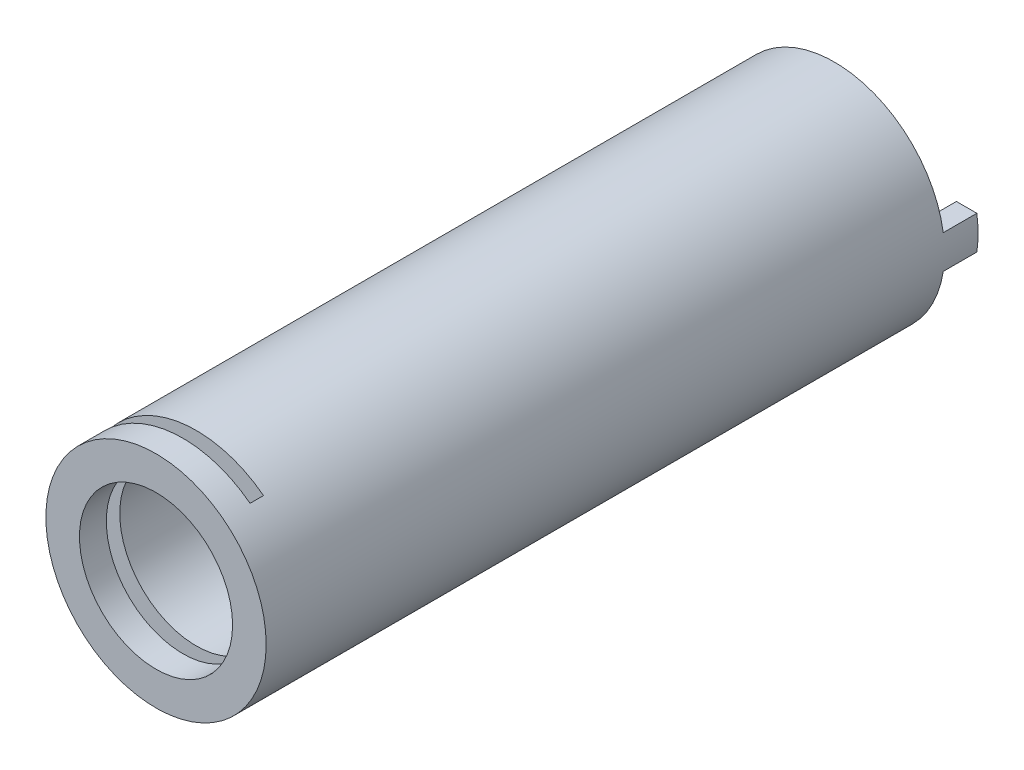
ISO-10303-21;
HEADER;
FILE_DESCRIPTION(('STEP AP214'),'2;1');
FILE_NAME('part.step','',(''),(''),'','','');
FILE_SCHEMA(('AUTOMOTIVE_DESIGN { 1 0 10303 214 1 1 1 1 }'));
ENDSEC;
DATA;
#1=APPLICATION_CONTEXT('core data for automotive mechanical design processes');
#2=APPLICATION_PROTOCOL_DEFINITION('international standard','automotive_design',2000,#1);
#3=PRODUCT_CONTEXT('',#1,'mechanical');
#4=PRODUCT('Part','Part','',(#3));
#5=PRODUCT_RELATED_PRODUCT_CATEGORY('part','',(#4));
#6=PRODUCT_DEFINITION_FORMATION('','',#4);
#7=PRODUCT_DEFINITION_CONTEXT('part definition',#1,'design');
#8=PRODUCT_DEFINITION('design','',#6,#7);
#9=PRODUCT_DEFINITION_SHAPE('','',#8);
#10=(LENGTH_UNIT() NAMED_UNIT(*) SI_UNIT(.MILLI.,.METRE.));
#11=(NAMED_UNIT(*) PLANE_ANGLE_UNIT() SI_UNIT($,.RADIAN.));
#12=(NAMED_UNIT(*) SI_UNIT($,.STERADIAN.) SOLID_ANGLE_UNIT());
#13=UNCERTAINTY_MEASURE_WITH_UNIT(LENGTH_MEASURE(1.E-05),#10,'distance_accuracy_value','');
#14=(GEOMETRIC_REPRESENTATION_CONTEXT(3) GLOBAL_UNCERTAINTY_ASSIGNED_CONTEXT((#13)) GLOBAL_UNIT_ASSIGNED_CONTEXT((#10,
#11,#12)) REPRESENTATION_CONTEXT('',''));
#15=CARTESIAN_POINT('',(0.,0.,0.));
#16=DIRECTION('',(0.,0.,1.));
#17=DIRECTION('',(1.,0.,0.));
#18=AXIS2_PLACEMENT_3D('',#15,#16,#17);
#19=CARTESIAN_POINT('',(0.,0.,0.));
#20=DIRECTION('',(0.,0.,1.));
#21=DIRECTION('',(1.,0.,0.));
#22=AXIS2_PLACEMENT_3D('',#19,#20,#21);
#23=PLANE('',#22);
#24=CARTESIAN_POINT('',(0.,0.,0.));
#25=DIRECTION('',(0.,0.,1.));
#26=DIRECTION('',(1.,0.,0.));
#27=AXIS2_PLACEMENT_3D('',#24,#25,#26);
#28=CIRCLE('',#27,11.4);
#29=CARTESIAN_POINT('',(11.4,0.,0.));
#30=VERTEX_POINT('',#29);
#31=EDGE_CURVE('E210',#30,#30,#28,.T.);
#32=ORIENTED_EDGE('',*,*,#31,.T.);
#33=EDGE_LOOP('',(#32));
#34=FACE_BOUND('',#33,.T.);
#35=DIRECTION('',(1.,0.,0.));
#36=VECTOR('',#35,1.);
#37=CARTESIAN_POINT('',(-13.1647255953172,2.5,0.));
#38=LINE('',#37,#36);
#39=CARTESIAN_POINT('',(-16.2083311910881,2.5,0.));
#40=VERTEX_POINT('',#39);
#41=CARTESIAN_POINT('',(-13.1647255953172,2.49999999999999,0.));
#42=VERTEX_POINT('',#41);
#43=EDGE_CURVE('E142',#40,#42,#38,.T.);
#44=ORIENTED_EDGE('',*,*,#43,.F.);
#45=CARTESIAN_POINT('',(0.,0.,0.));
#46=DIRECTION('',(0.,0.,1.));
#47=DIRECTION('',(1.,0.,0.));
#48=AXIS2_PLACEMENT_3D('',#45,#46,#47);
#49=CIRCLE('',#48,16.4);
#50=CARTESIAN_POINT('',(16.2083311910881,2.5,0.));
#51=VERTEX_POINT('',#50);
#52=EDGE_CURVE('E220',#51,#40,#49,.T.);
#53=ORIENTED_EDGE('',*,*,#52,.F.);
#54=DIRECTION('',(1.,0.,0.));
#55=VECTOR('',#54,1.);
#56=CARTESIAN_POINT('',(16.2083311910881,2.5,0.));
#57=LINE('',#56,#55);
#58=CARTESIAN_POINT('',(13.1647255953172,2.5,0.));
#59=VERTEX_POINT('',#58);
#60=EDGE_CURVE('E65',#59,#51,#57,.T.);
#61=ORIENTED_EDGE('',*,*,#60,.F.);
#62=CARTESIAN_POINT('',(0.,0.,0.));
#63=DIRECTION('',(0.,0.,1.));
#64=DIRECTION('',(-1.,0.,0.));
#65=AXIS2_PLACEMENT_3D('',#62,#63,#64);
#66=CIRCLE('',#65,13.4);
#67=CARTESIAN_POINT('',(13.1647255953172,-2.5,0.));
#68=VERTEX_POINT('',#67);
#69=EDGE_CURVE('E177',#68,#59,#66,.T.);
#70=ORIENTED_EDGE('',*,*,#69,.F.);
#71=DIRECTION('',(-1.,0.,0.));
#72=VECTOR('',#71,1.);
#73=CARTESIAN_POINT('',(16.2083311910881,-2.5,0.));
#74=LINE('',#73,#72);
#75=CARTESIAN_POINT('',(16.2083311910881,-2.5,0.));
#76=VERTEX_POINT('',#75);
#77=EDGE_CURVE('E160',#76,#68,#74,.T.);
#78=ORIENTED_EDGE('',*,*,#77,.F.);
#79=CARTESIAN_POINT('',(-16.2083311910881,-2.5,0.));
#80=VERTEX_POINT('',#79);
#81=EDGE_CURVE('E151',#80,#76,#49,.T.);
#82=ORIENTED_EDGE('',*,*,#81,.F.);
#83=DIRECTION('',(-1.,0.,0.));
#84=VECTOR('',#83,1.);
#85=CARTESIAN_POINT('',(-13.1647255953172,-2.5,0.));
#86=LINE('',#85,#84);
#87=CARTESIAN_POINT('',(-13.1647255953172,-2.5,0.));
#88=VERTEX_POINT('',#87);
#89=EDGE_CURVE('E143',#88,#80,#86,.T.);
#90=ORIENTED_EDGE('',*,*,#89,.F.);
#91=CARTESIAN_POINT('',(0.,0.,0.));
#92=DIRECTION('',(0.,0.,1.));
#93=DIRECTION('',(-1.,0.,0.));
#94=AXIS2_PLACEMENT_3D('',#91,#92,#93);
#95=CIRCLE('',#94,13.4);
#96=EDGE_CURVE('E132',#42,#88,#95,.T.);
#97=ORIENTED_EDGE('',*,*,#96,.F.);
#98=EDGE_LOOP('',(#44,#53,#61,#70,#78,#82,#90,#97));
#99=FACE_BOUND('',#98,.T.);
#100=ADVANCED_FACE('F42',(#34,#99),#23,.F.);
#101=CARTESIAN_POINT('',(0.,0.,101.));
#102=DIRECTION('',(0.,0.,1.));
#103=DIRECTION('',(1.,0.,0.));
#104=AXIS2_PLACEMENT_3D('',#101,#102,#103);
#105=PLANE('',#104);
#106=CARTESIAN_POINT('',(0.,0.,101.));
#107=DIRECTION('',(0.,0.,1.));
#108=DIRECTION('',(1.,0.,0.));
#109=AXIS2_PLACEMENT_3D('',#106,#107,#108);
#110=CIRCLE('',#109,16.4);
#111=CARTESIAN_POINT('',(16.4,0.,101.));
#112=VERTEX_POINT('',#111);
#113=EDGE_CURVE('E216',#112,#112,#110,.T.);
#114=ORIENTED_EDGE('',*,*,#113,.T.);
#115=EDGE_LOOP('',(#114));
#116=FACE_BOUND('',#115,.T.);
#117=CARTESIAN_POINT('',(0.,0.,101.));
#118=DIRECTION('',(0.,0.,1.));
#119=DIRECTION('',(1.,0.,0.));
#120=AXIS2_PLACEMENT_3D('',#117,#118,#119);
#121=CIRCLE('',#120,11.4);
#122=CARTESIAN_POINT('',(11.4,0.,101.));
#123=VERTEX_POINT('',#122);
#124=EDGE_CURVE('E211',#123,#123,#121,.T.);
#125=ORIENTED_EDGE('',*,*,#124,.F.);
#126=EDGE_LOOP('',(#125));
#127=FACE_BOUND('',#126,.T.);
#128=ADVANCED_FACE('F258',(#116,#127),#105,.T.);
#129=CARTESIAN_POINT('',(0.,0.,101.));
#130=DIRECTION('',(0.,0.,-1.));
#131=DIRECTION('',(-1.,0.,0.));
#132=AXIS2_PLACEMENT_3D('',#129,#130,#131);
#133=CYLINDRICAL_SURFACE('',#132,16.4);
#134=CARTESIAN_POINT('',(0.,0.,97.));
#135=DIRECTION('',(0.,0.,-1.));
#136=DIRECTION('',(-1.,0.,0.));
#137=AXIS2_PLACEMENT_3D('',#134,#135,#136);
#138=CIRCLE('',#137,16.4);
#139=CARTESIAN_POINT('',(10.0001,-12.9983845146233,97.));
#140=VERTEX_POINT('',#139);
#141=CARTESIAN_POINT('',(10.0001,12.9983845146233,97.));
#142=VERTEX_POINT('',#141);
#143=EDGE_CURVE('E207',#140,#142,#138,.T.);
#144=ORIENTED_EDGE('',*,*,#143,.F.);
#145=DIRECTION('',(0.,0.,-1.));
#146=VECTOR('',#145,1.);
#147=CARTESIAN_POINT('',(10.0001,-12.9983845146233,101.));
#148=LINE('',#147,#146);
#149=CARTESIAN_POINT('',(10.0001,-12.9983845146233,95.));
#150=VERTEX_POINT('',#149);
#151=EDGE_CURVE('E202',#140,#150,#148,.T.);
#152=ORIENTED_EDGE('',*,*,#151,.T.);
#153=CARTESIAN_POINT('',(0.,0.,95.));
#154=DIRECTION('',(0.,0.,1.));
#155=DIRECTION('',(1.,0.,0.));
#156=AXIS2_PLACEMENT_3D('',#153,#154,#155);
#157=CIRCLE('',#156,16.4);
#158=CARTESIAN_POINT('',(10.0001,12.9983845146233,95.));
#159=VERTEX_POINT('',#158);
#160=EDGE_CURVE('E205',#159,#150,#157,.T.);
#161=ORIENTED_EDGE('',*,*,#160,.F.);
#162=DIRECTION('',(0.,0.,-1.));
#163=VECTOR('',#162,1.);
#164=CARTESIAN_POINT('',(10.0001,12.9983845146233,101.));
#165=LINE('',#164,#163);
#166=EDGE_CURVE('E199',#159,#142,#165,.F.);
#167=ORIENTED_EDGE('',*,*,#166,.T.);
#168=EDGE_LOOP('',(#144,#152,#161,#167));
#169=FACE_BOUND('',#168,.T.);
#170=ORIENTED_EDGE('',*,*,#113,.F.);
#171=EDGE_LOOP('',(#170));
#172=FACE_BOUND('',#171,.T.);
#173=ORIENTED_EDGE('',*,*,#52,.T.);
#174=DIRECTION('',(0.,0.,1.));
#175=VECTOR('',#174,1.);
#176=CARTESIAN_POINT('',(-16.2083311910881,2.5,-5.));
#177=LINE('',#176,#175);
#178=CARTESIAN_POINT('',(-16.2083311910881,2.5,-5.));
#179=VERTEX_POINT('',#178);
#180=EDGE_CURVE('E396',#179,#40,#177,.T.);
#181=ORIENTED_EDGE('',*,*,#180,.F.);
#182=CARTESIAN_POINT('',(0.,0.,-5.));
#183=DIRECTION('',(0.,0.,-1.));
#184=DIRECTION('',(-1.,0.,0.));
#185=AXIS2_PLACEMENT_3D('',#182,#183,#184);
#186=CIRCLE('',#185,16.4);
#187=CARTESIAN_POINT('',(-16.2083311910881,-2.5,-5.));
#188=VERTEX_POINT('',#187);
#189=EDGE_CURVE('E152',#188,#179,#186,.T.);
#190=ORIENTED_EDGE('',*,*,#189,.F.);
#191=DIRECTION('',(0.,0.,1.));
#192=VECTOR('',#191,1.);
#193=CARTESIAN_POINT('',(-16.2083311910881,-2.5,-5.));
#194=LINE('',#193,#192);
#195=EDGE_CURVE('E57',#188,#80,#194,.T.);
#196=ORIENTED_EDGE('',*,*,#195,.T.);
#197=ORIENTED_EDGE('',*,*,#81,.T.);
#198=DIRECTION('',(0.,0.,1.));
#199=VECTOR('',#198,1.);
#200=CARTESIAN_POINT('',(16.2083311910881,-2.5,-5.));
#201=LINE('',#200,#199);
#202=CARTESIAN_POINT('',(16.2083311910881,-2.5,-5.));
#203=VERTEX_POINT('',#202);
#204=EDGE_CURVE('E188',#203,#76,#201,.T.);
#205=ORIENTED_EDGE('',*,*,#204,.F.);
#206=CARTESIAN_POINT('',(0.,0.,-5.));
#207=DIRECTION('',(0.,0.,-1.));
#208=DIRECTION('',(-1.,0.,0.));
#209=AXIS2_PLACEMENT_3D('',#206,#207,#208);
#210=CIRCLE('',#209,16.4);
#211=CARTESIAN_POINT('',(16.2083311910881,2.5,-5.));
#212=VERTEX_POINT('',#211);
#213=EDGE_CURVE('E165',#212,#203,#210,.T.);
#214=ORIENTED_EDGE('',*,*,#213,.F.);
#215=DIRECTION('',(0.,0.,1.));
#216=VECTOR('',#215,1.);
#217=CARTESIAN_POINT('',(16.2083311910881,2.5,-5.));
#218=LINE('',#217,#216);
#219=EDGE_CURVE('E174',#212,#51,#218,.T.);
#220=ORIENTED_EDGE('',*,*,#219,.T.);
#221=EDGE_LOOP('',(#173,#181,#190,#196,#197,#205,#214,#220));
#222=FACE_BOUND('',#221,.T.);
#223=ADVANCED_FACE('F44',(#169,#172,#222),#133,.T.);
#224=CARTESIAN_POINT('',(0.,0.,101.));
#225=DIRECTION('',(0.,0.,-1.));
#226=DIRECTION('',(-1.,0.,0.));
#227=AXIS2_PLACEMENT_3D('',#224,#225,#226);
#228=CYLINDRICAL_SURFACE('',#227,11.4);
#229=DIRECTION('',(0.,0.,-1.));
#230=VECTOR('',#229,1.);
#231=CARTESIAN_POINT('',(10.0001,-5.47339017337518,101.));
#232=LINE('',#231,#230);
#233=CARTESIAN_POINT('',(10.0001,-5.47339017337518,97.));
#234=VERTEX_POINT('',#233);
#235=CARTESIAN_POINT('',(10.0001,-5.47339017337518,95.));
#236=VERTEX_POINT('',#235);
#237=EDGE_CURVE('E11',#234,#236,#232,.T.);
#238=ORIENTED_EDGE('',*,*,#237,.F.);
#239=CARTESIAN_POINT('',(0.,0.,97.));
#240=DIRECTION('',(0.,0.,-1.));
#241=DIRECTION('',(-1.,0.,0.));
#242=AXIS2_PLACEMENT_3D('',#239,#240,#241);
#243=CIRCLE('',#242,11.4);
#244=CARTESIAN_POINT('',(10.0001,5.47339017337518,97.));
#245=VERTEX_POINT('',#244);
#246=EDGE_CURVE('E50',#234,#245,#243,.T.);
#247=ORIENTED_EDGE('',*,*,#246,.T.);
#248=DIRECTION('',(0.,0.,-1.));
#249=VECTOR('',#248,1.);
#250=CARTESIAN_POINT('',(10.0001,5.47339017337518,101.));
#251=LINE('',#250,#249);
#252=CARTESIAN_POINT('',(10.0001,5.47339017337518,95.));
#253=VERTEX_POINT('',#252);
#254=EDGE_CURVE('E219',#253,#245,#251,.F.);
#255=ORIENTED_EDGE('',*,*,#254,.F.);
#256=CARTESIAN_POINT('',(0.,0.,95.));
#257=DIRECTION('',(0.,0.,1.));
#258=DIRECTION('',(1.,0.,0.));
#259=AXIS2_PLACEMENT_3D('',#256,#257,#258);
#260=CIRCLE('',#259,11.4);
#261=EDGE_CURVE('E224',#253,#236,#260,.T.);
#262=ORIENTED_EDGE('',*,*,#261,.T.);
#263=EDGE_LOOP('',(#238,#247,#255,#262));
#264=FACE_BOUND('',#263,.T.);
#265=ORIENTED_EDGE('',*,*,#124,.T.);
#266=EDGE_LOOP('',(#265));
#267=FACE_BOUND('',#266,.T.);
#268=ORIENTED_EDGE('',*,*,#31,.F.);
#269=EDGE_LOOP('',(#268));
#270=FACE_BOUND('',#269,.T.);
#271=ADVANCED_FACE('F230',(#264,#267,#270),#228,.F.);
#272=CARTESIAN_POINT('',(10.0001,25.5795363709033,97.));
#273=DIRECTION('',(0.,0.,-1.));
#274=DIRECTION('',(-1.,0.,0.));
#275=AXIS2_PLACEMENT_3D('',#272,#273,#274);
#276=PLANE('',#275);
#277=ORIENTED_EDGE('',*,*,#143,.T.);
#278=DIRECTION('',(0.,-1.,0.));
#279=VECTOR('',#278,1.);
#280=CARTESIAN_POINT('',(10.0001,25.5795363709033,97.));
#281=LINE('',#280,#279);
#282=EDGE_CURVE('E194',#142,#245,#281,.T.);
#283=ORIENTED_EDGE('',*,*,#282,.T.);
#284=ORIENTED_EDGE('',*,*,#246,.F.);
#285=EDGE_CURVE('E191',#234,#140,#281,.T.);
#286=ORIENTED_EDGE('',*,*,#285,.T.);
#287=EDGE_LOOP('',(#277,#283,#284,#286));
#288=FACE_BOUND('',#287,.T.);
#289=ADVANCED_FACE('F235',(#288),#276,.T.);
#290=CARTESIAN_POINT('',(10.0001,25.5795363709033,95.));
#291=DIRECTION('',(0.,0.,1.));
#292=DIRECTION('',(1.,0.,0.));
#293=AXIS2_PLACEMENT_3D('',#290,#291,#292);
#294=PLANE('',#293);
#295=ORIENTED_EDGE('',*,*,#160,.T.);
#296=DIRECTION('',(0.,1.,0.));
#297=VECTOR('',#296,1.);
#298=CARTESIAN_POINT('',(10.0001,25.5795363709033,95.));
#299=LINE('',#298,#297);
#300=EDGE_CURVE('E198',#150,#236,#299,.T.);
#301=ORIENTED_EDGE('',*,*,#300,.T.);
#302=ORIENTED_EDGE('',*,*,#261,.F.);
#303=EDGE_CURVE('E195',#253,#159,#299,.T.);
#304=ORIENTED_EDGE('',*,*,#303,.T.);
#305=EDGE_LOOP('',(#295,#301,#302,#304));
#306=FACE_BOUND('',#305,.T.);
#307=ADVANCED_FACE('F248',(#306),#294,.T.);
#308=CARTESIAN_POINT('',(10.0001,0.,0.));
#309=DIRECTION('',(1.,0.,0.));
#310=DIRECTION('',(0.,0.,-1.));
#311=AXIS2_PLACEMENT_3D('',#308,#309,#310);
#312=PLANE('',#311);
#313=ORIENTED_EDGE('',*,*,#285,.F.);
#314=ORIENTED_EDGE('',*,*,#237,.T.);
#315=ORIENTED_EDGE('',*,*,#300,.F.);
#316=ORIENTED_EDGE('',*,*,#151,.F.);
#317=EDGE_LOOP('',(#313,#314,#315,#316));
#318=FACE_BOUND('',#317,.T.);
#319=ADVANCED_FACE('F238',(#318),#312,.F.);
#320=ORIENTED_EDGE('',*,*,#303,.F.);
#321=ORIENTED_EDGE('',*,*,#254,.T.);
#322=ORIENTED_EDGE('',*,*,#282,.F.);
#323=ORIENTED_EDGE('',*,*,#166,.F.);
#324=EDGE_LOOP('',(#320,#321,#322,#323));
#325=FACE_BOUND('',#324,.T.);
#326=ADVANCED_FACE('F245',(#325),#312,.F.);
#327=CARTESIAN_POINT('',(16.2083311910881,-2.5,-5.));
#328=DIRECTION('',(0.,1.,0.));
#329=DIRECTION('',(0.,0.,1.));
#330=AXIS2_PLACEMENT_3D('',#327,#328,#329);
#331=PLANE('',#330);
#332=ORIENTED_EDGE('',*,*,#77,.T.);
#333=DIRECTION('',(0.,0.,1.));
#334=VECTOR('',#333,1.);
#335=CARTESIAN_POINT('',(13.1647255953172,-2.5,-5.));
#336=LINE('',#335,#334);
#337=CARTESIAN_POINT('',(13.1647255953172,-2.5,-5.));
#338=VERTEX_POINT('',#337);
#339=EDGE_CURVE('E185',#338,#68,#336,.T.);
#340=ORIENTED_EDGE('',*,*,#339,.F.);
#341=DIRECTION('',(-1.,0.,0.));
#342=VECTOR('',#341,1.);
#343=CARTESIAN_POINT('',(16.2083311910881,-2.5,-5.));
#344=LINE('',#343,#342);
#345=EDGE_CURVE('E168',#203,#338,#344,.T.);
#346=ORIENTED_EDGE('',*,*,#345,.F.);
#347=ORIENTED_EDGE('',*,*,#204,.T.);
#348=EDGE_LOOP('',(#332,#340,#346,#347));
#349=FACE_BOUND('',#348,.T.);
#350=ADVANCED_FACE('F278',(#349),#331,.F.);
#351=CARTESIAN_POINT('',(0.,0.,-5.));
#352=DIRECTION('',(0.,0.,1.));
#353=DIRECTION('',(1.,0.,0.));
#354=AXIS2_PLACEMENT_3D('',#351,#352,#353);
#355=CYLINDRICAL_SURFACE('',#354,13.4);
#356=ORIENTED_EDGE('',*,*,#69,.T.);
#357=DIRECTION('',(0.,0.,1.));
#358=VECTOR('',#357,1.);
#359=CARTESIAN_POINT('',(13.1647255953172,2.5,-5.));
#360=LINE('',#359,#358);
#361=CARTESIAN_POINT('',(13.1647255953172,2.5,-5.));
#362=VERTEX_POINT('',#361);
#363=EDGE_CURVE('E182',#362,#59,#360,.T.);
#364=ORIENTED_EDGE('',*,*,#363,.F.);
#365=CARTESIAN_POINT('',(0.,0.,-5.));
#366=DIRECTION('',(0.,0.,1.));
#367=DIRECTION('',(-1.,0.,0.));
#368=AXIS2_PLACEMENT_3D('',#365,#366,#367);
#369=CIRCLE('',#368,13.4);
#370=EDGE_CURVE('E170',#338,#362,#369,.T.);
#371=ORIENTED_EDGE('',*,*,#370,.F.);
#372=ORIENTED_EDGE('',*,*,#339,.T.);
#373=EDGE_LOOP('',(#356,#364,#371,#372));
#374=FACE_BOUND('',#373,.T.);
#375=ADVANCED_FACE('F281',(#374),#355,.F.);
#376=CARTESIAN_POINT('',(16.2083311910881,2.5,-5.));
#377=DIRECTION('',(0.,-1.,0.));
#378=DIRECTION('',(0.,0.,-1.));
#379=AXIS2_PLACEMENT_3D('',#376,#377,#378);
#380=PLANE('',#379);
#381=ORIENTED_EDGE('',*,*,#60,.T.);
#382=ORIENTED_EDGE('',*,*,#219,.F.);
#383=DIRECTION('',(1.,0.,0.));
#384=VECTOR('',#383,1.);
#385=CARTESIAN_POINT('',(16.2083311910881,2.5,-5.));
#386=LINE('',#385,#384);
#387=EDGE_CURVE('E172',#362,#212,#386,.T.);
#388=ORIENTED_EDGE('',*,*,#387,.F.);
#389=ORIENTED_EDGE('',*,*,#363,.T.);
#390=EDGE_LOOP('',(#381,#382,#388,#389));
#391=FACE_BOUND('',#390,.T.);
#392=ADVANCED_FACE('F290',(#391),#380,.F.);
#393=CARTESIAN_POINT('',(0.,0.,-5.));
#394=DIRECTION('',(0.,0.,-1.));
#395=DIRECTION('',(-1.,0.,0.));
#396=AXIS2_PLACEMENT_3D('',#393,#394,#395);
#397=PLANE('',#396);
#398=ORIENTED_EDGE('',*,*,#213,.T.);
#399=ORIENTED_EDGE('',*,*,#345,.T.);
#400=ORIENTED_EDGE('',*,*,#370,.T.);
#401=ORIENTED_EDGE('',*,*,#387,.T.);
#402=EDGE_LOOP('',(#398,#399,#400,#401));
#403=FACE_BOUND('',#402,.T.);
#404=ADVANCED_FACE('F299',(#403),#397,.T.);
#405=CARTESIAN_POINT('',(-13.1647255953172,2.5,-5.));
#406=DIRECTION('',(0.,-1.,0.));
#407=DIRECTION('',(0.,0.,-1.));
#408=AXIS2_PLACEMENT_3D('',#405,#406,#407);
#409=PLANE('',#408);
#410=ORIENTED_EDGE('',*,*,#43,.T.);
#411=DIRECTION('',(0.,0.,1.));
#412=VECTOR('',#411,1.);
#413=CARTESIAN_POINT('',(-13.1647255953172,2.49999999999999,-5.));
#414=LINE('',#413,#412);
#415=CARTESIAN_POINT('',(-13.1647255953172,2.49999999999999,-5.));
#416=VERTEX_POINT('',#415);
#417=EDGE_CURVE('E139',#416,#42,#414,.T.);
#418=ORIENTED_EDGE('',*,*,#417,.F.);
#419=DIRECTION('',(1.,0.,0.));
#420=VECTOR('',#419,1.);
#421=CARTESIAN_POINT('',(-13.1647255953172,2.5,-5.));
#422=LINE('',#421,#420);
#423=EDGE_CURVE('E155',#179,#416,#422,.T.);
#424=ORIENTED_EDGE('',*,*,#423,.F.);
#425=ORIENTED_EDGE('',*,*,#180,.T.);
#426=EDGE_LOOP('',(#410,#418,#424,#425));
#427=FACE_BOUND('',#426,.T.);
#428=ADVANCED_FACE('F308',(#427),#409,.F.);
#429=CARTESIAN_POINT('',(0.,0.,-5.));
#430=DIRECTION('',(0.,0.,1.));
#431=DIRECTION('',(1.,0.,0.));
#432=AXIS2_PLACEMENT_3D('',#429,#430,#431);
#433=CYLINDRICAL_SURFACE('',#432,13.4);
#434=ORIENTED_EDGE('',*,*,#96,.T.);
#435=DIRECTION('',(0.,0.,1.));
#436=VECTOR('',#435,1.);
#437=CARTESIAN_POINT('',(-13.1647255953172,-2.5,-5.));
#438=LINE('',#437,#436);
#439=CARTESIAN_POINT('',(-13.1647255953172,-2.5,-5.));
#440=VERTEX_POINT('',#439);
#441=EDGE_CURVE('E136',#440,#88,#438,.T.);
#442=ORIENTED_EDGE('',*,*,#441,.F.);
#443=CARTESIAN_POINT('',(0.,0.,-5.));
#444=DIRECTION('',(0.,0.,1.));
#445=DIRECTION('',(-1.,0.,0.));
#446=AXIS2_PLACEMENT_3D('',#443,#444,#445);
#447=CIRCLE('',#446,13.4);
#448=EDGE_CURVE('E162',#416,#440,#447,.T.);
#449=ORIENTED_EDGE('',*,*,#448,.F.);
#450=ORIENTED_EDGE('',*,*,#417,.T.);
#451=EDGE_LOOP('',(#434,#442,#449,#450));
#452=FACE_BOUND('',#451,.T.);
#453=ADVANCED_FACE('F134',(#452),#433,.F.);
#454=CARTESIAN_POINT('',(-13.1647255953172,-2.5,-5.));
#455=DIRECTION('',(0.,1.,0.));
#456=DIRECTION('',(0.,0.,1.));
#457=AXIS2_PLACEMENT_3D('',#454,#455,#456);
#458=PLANE('',#457);
#459=ORIENTED_EDGE('',*,*,#89,.T.);
#460=ORIENTED_EDGE('',*,*,#195,.F.);
#461=DIRECTION('',(-1.,0.,0.));
#462=VECTOR('',#461,1.);
#463=CARTESIAN_POINT('',(-13.1647255953172,-2.5,-5.));
#464=LINE('',#463,#462);
#465=EDGE_CURVE('E148',#440,#188,#464,.T.);
#466=ORIENTED_EDGE('',*,*,#465,.F.);
#467=ORIENTED_EDGE('',*,*,#441,.T.);
#468=EDGE_LOOP('',(#459,#460,#466,#467));
#469=FACE_BOUND('',#468,.T.);
#470=ADVANCED_FACE('F146',(#469),#458,.F.);
#471=CARTESIAN_POINT('',(0.,0.,-5.));
#472=DIRECTION('',(0.,0.,-1.));
#473=DIRECTION('',(-1.,0.,0.));
#474=AXIS2_PLACEMENT_3D('',#471,#472,#473);
#475=PLANE('',#474);
#476=ORIENTED_EDGE('',*,*,#189,.T.);
#477=ORIENTED_EDGE('',*,*,#423,.T.);
#478=ORIENTED_EDGE('',*,*,#448,.T.);
#479=ORIENTED_EDGE('',*,*,#465,.T.);
#480=EDGE_LOOP('',(#476,#477,#478,#479));
#481=FACE_BOUND('',#480,.T.);
#482=ADVANCED_FACE('F332',(#481),#475,.T.);
#483=CLOSED_SHELL('',(#100,#128,#223,#271,#289,#307,#319,#326,#350,#375,#392,#404,#428,#453,
#470,#482));
#484=MANIFOLD_SOLID_BREP('B2',#483);
#485=ADVANCED_BREP_SHAPE_REPRESENTATION('',(#18,#484),#14);
#486=SHAPE_DEFINITION_REPRESENTATION(#9,#485);
ENDSEC;
END-ISO-10303-21;
